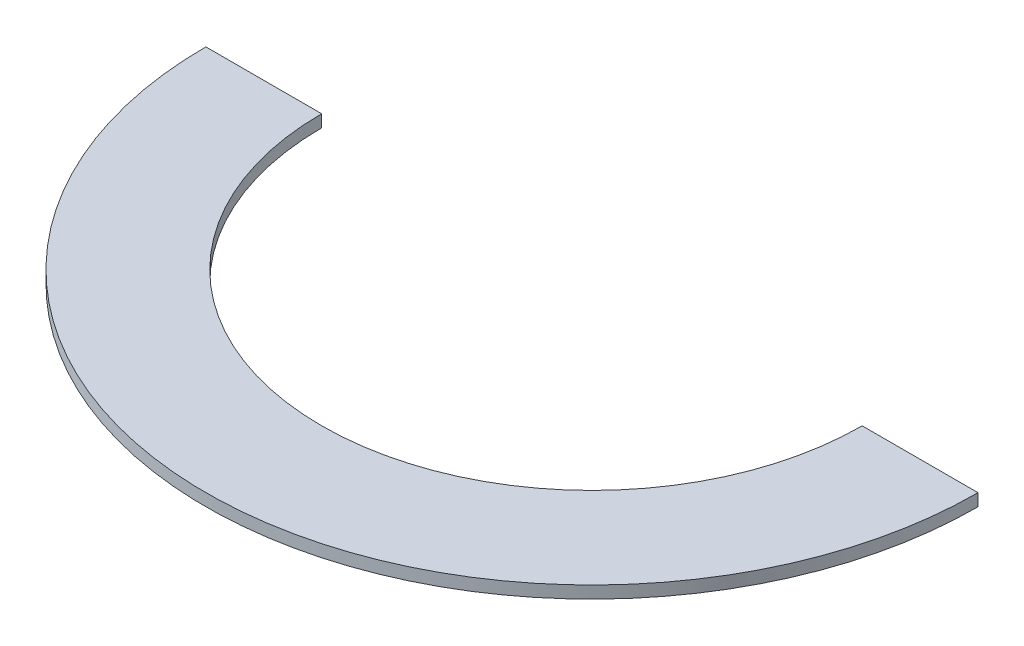
ISO-10303-21;
HEADER;
FILE_DESCRIPTION(('STEP AP214'),'2;1');
FILE_NAME('part.step','',(''),(''),'','','');
FILE_SCHEMA(('AUTOMOTIVE_DESIGN { 1 0 10303 214 1 1 1 1 }'));
ENDSEC;
DATA;
#1=APPLICATION_CONTEXT('core data for automotive mechanical design processes');
#2=APPLICATION_PROTOCOL_DEFINITION('international standard','automotive_design',2000,#1);
#3=PRODUCT_CONTEXT('',#1,'mechanical');
#4=PRODUCT('Part','Part','',(#3));
#5=PRODUCT_RELATED_PRODUCT_CATEGORY('part','',(#4));
#6=PRODUCT_DEFINITION_FORMATION('','',#4);
#7=PRODUCT_DEFINITION_CONTEXT('part definition',#1,'design');
#8=PRODUCT_DEFINITION('design','',#6,#7);
#9=PRODUCT_DEFINITION_SHAPE('','',#8);
#10=(LENGTH_UNIT() NAMED_UNIT(*) SI_UNIT(.MILLI.,.METRE.));
#11=(NAMED_UNIT(*) PLANE_ANGLE_UNIT() SI_UNIT($,.RADIAN.));
#12=(NAMED_UNIT(*) SI_UNIT($,.STERADIAN.) SOLID_ANGLE_UNIT());
#13=UNCERTAINTY_MEASURE_WITH_UNIT(LENGTH_MEASURE(1.E-05),#10,'distance_accuracy_value','');
#14=(GEOMETRIC_REPRESENTATION_CONTEXT(3) GLOBAL_UNCERTAINTY_ASSIGNED_CONTEXT((#13)) GLOBAL_UNIT_ASSIGNED_CONTEXT((#10,
#11,#12)) REPRESENTATION_CONTEXT('',''));
#15=CARTESIAN_POINT('',(0.,0.,0.));
#16=DIRECTION('',(0.,0.,1.));
#17=DIRECTION('',(1.,0.,0.));
#18=AXIS2_PLACEMENT_3D('',#15,#16,#17);
#19=CARTESIAN_POINT('',(0.,1.5875,0.));
#20=DIRECTION('',(0.,-1.,0.));
#21=DIRECTION('',(0.,0.,-1.));
#22=AXIS2_PLACEMENT_3D('',#19,#20,#21);
#23=CYLINDRICAL_SURFACE('',#22,50.);
#24=CARTESIAN_POINT('',(0.,0.,0.));
#25=DIRECTION('',(0.,1.,0.));
#26=DIRECTION('',(0.,0.,1.));
#27=AXIS2_PLACEMENT_3D('',#24,#25,#26);
#28=CIRCLE('',#27,50.);
#29=CARTESIAN_POINT('',(-50.,0.,0.));
#30=VERTEX_POINT('',#29);
#31=CARTESIAN_POINT('',(50.,0.,0.));
#32=VERTEX_POINT('',#31);
#33=EDGE_CURVE('E96',#30,#32,#28,.T.);
#34=ORIENTED_EDGE('',*,*,#33,.T.);
#35=DIRECTION('',(0.,-1.,0.));
#36=VECTOR('',#35,1.);
#37=CARTESIAN_POINT('',(50.,1.5875,0.));
#38=LINE('',#37,#36);
#39=CARTESIAN_POINT('',(50.,1.5875,0.));
#40=VERTEX_POINT('',#39);
#41=EDGE_CURVE('E11',#40,#32,#38,.T.);
#42=ORIENTED_EDGE('',*,*,#41,.F.);
#43=CARTESIAN_POINT('',(0.,1.5875,0.));
#44=DIRECTION('',(0.,1.,0.));
#45=DIRECTION('',(0.,0.,1.));
#46=AXIS2_PLACEMENT_3D('',#43,#44,#45);
#47=CIRCLE('',#46,50.);
#48=CARTESIAN_POINT('',(-50.,1.5875,0.));
#49=VERTEX_POINT('',#48);
#50=EDGE_CURVE('E84',#49,#40,#47,.T.);
#51=ORIENTED_EDGE('',*,*,#50,.F.);
#52=DIRECTION('',(0.,-1.,0.));
#53=VECTOR('',#52,1.);
#54=CARTESIAN_POINT('',(-50.,1.5875,0.));
#55=LINE('',#54,#53);
#56=EDGE_CURVE('E92',#49,#30,#55,.T.);
#57=ORIENTED_EDGE('',*,*,#56,.T.);
#58=EDGE_LOOP('',(#34,#42,#51,#57));
#59=FACE_BOUND('',#58,.T.);
#60=ADVANCED_FACE('F33',(#59),#23,.T.);
#61=CARTESIAN_POINT('',(35.,1.5875,0.));
#62=DIRECTION('',(0.,0.,1.));
#63=DIRECTION('',(1.,0.,0.));
#64=AXIS2_PLACEMENT_3D('',#61,#62,#63);
#65=PLANE('',#64);
#66=DIRECTION('',(-1.,0.,0.));
#67=VECTOR('',#66,1.);
#68=CARTESIAN_POINT('',(35.,0.,0.));
#69=LINE('',#68,#67);
#70=CARTESIAN_POINT('',(35.,0.,0.));
#71=VERTEX_POINT('',#70);
#72=EDGE_CURVE('E88',#32,#71,#69,.T.);
#73=ORIENTED_EDGE('',*,*,#72,.T.);
#74=DIRECTION('',(0.,-1.,0.));
#75=VECTOR('',#74,1.);
#76=CARTESIAN_POINT('',(35.,1.5875,0.));
#77=LINE('',#76,#75);
#78=CARTESIAN_POINT('',(35.,1.5875,0.));
#79=VERTEX_POINT('',#78);
#80=EDGE_CURVE('E41',#79,#71,#77,.T.);
#81=ORIENTED_EDGE('',*,*,#80,.F.);
#82=DIRECTION('',(-1.,0.,0.));
#83=VECTOR('',#82,1.);
#84=CARTESIAN_POINT('',(35.,1.5875,0.));
#85=LINE('',#84,#83);
#86=EDGE_CURVE('E79',#40,#79,#85,.T.);
#87=ORIENTED_EDGE('',*,*,#86,.F.);
#88=ORIENTED_EDGE('',*,*,#41,.T.);
#89=EDGE_LOOP('',(#73,#81,#87,#88));
#90=FACE_BOUND('',#89,.T.);
#91=ADVANCED_FACE('F87',(#90),#65,.F.);
#92=CARTESIAN_POINT('',(0.,1.5875,0.));
#93=DIRECTION('',(0.,-1.,0.));
#94=DIRECTION('',(0.,0.,-1.));
#95=AXIS2_PLACEMENT_3D('',#92,#93,#94);
#96=CYLINDRICAL_SURFACE('',#95,35.);
#97=CARTESIAN_POINT('',(0.,0.,0.));
#98=DIRECTION('',(0.,-1.,0.));
#99=DIRECTION('',(0.,0.,1.));
#100=AXIS2_PLACEMENT_3D('',#97,#98,#99);
#101=CIRCLE('',#100,35.);
#102=CARTESIAN_POINT('',(-35.,0.,0.));
#103=VERTEX_POINT('',#102);
#104=EDGE_CURVE('E66',#71,#103,#101,.T.);
#105=ORIENTED_EDGE('',*,*,#104,.T.);
#106=DIRECTION('',(0.,-1.,0.));
#107=VECTOR('',#106,1.);
#108=CARTESIAN_POINT('',(-35.,1.5875,0.));
#109=LINE('',#108,#107);
#110=CARTESIAN_POINT('',(-35.,1.5875,0.));
#111=VERTEX_POINT('',#110);
#112=EDGE_CURVE('E89',#111,#103,#109,.T.);
#113=ORIENTED_EDGE('',*,*,#112,.F.);
#114=CARTESIAN_POINT('',(0.,1.5875,0.));
#115=DIRECTION('',(0.,-1.,0.));
#116=DIRECTION('',(0.,0.,1.));
#117=AXIS2_PLACEMENT_3D('',#114,#115,#116);
#118=CIRCLE('',#117,35.);
#119=EDGE_CURVE('E82',#79,#111,#118,.T.);
#120=ORIENTED_EDGE('',*,*,#119,.F.);
#121=ORIENTED_EDGE('',*,*,#80,.T.);
#122=EDGE_LOOP('',(#105,#113,#120,#121));
#123=FACE_BOUND('',#122,.T.);
#124=ADVANCED_FACE('F90',(#123),#96,.F.);
#125=CARTESIAN_POINT('',(-50.,1.5875,0.));
#126=DIRECTION('',(0.,0.,1.));
#127=DIRECTION('',(1.,0.,0.));
#128=AXIS2_PLACEMENT_3D('',#125,#126,#127);
#129=PLANE('',#128);
#130=DIRECTION('',(-1.,0.,0.));
#131=VECTOR('',#130,1.);
#132=CARTESIAN_POINT('',(-50.,0.,0.));
#133=LINE('',#132,#131);
#134=EDGE_CURVE('E72',#103,#30,#133,.T.);
#135=ORIENTED_EDGE('',*,*,#134,.T.);
#136=ORIENTED_EDGE('',*,*,#56,.F.);
#137=DIRECTION('',(-1.,0.,0.));
#138=VECTOR('',#137,1.);
#139=CARTESIAN_POINT('',(-50.,1.5875,0.));
#140=LINE('',#139,#138);
#141=EDGE_CURVE('E49',#111,#49,#140,.T.);
#142=ORIENTED_EDGE('',*,*,#141,.F.);
#143=ORIENTED_EDGE('',*,*,#112,.T.);
#144=EDGE_LOOP('',(#135,#136,#142,#143));
#145=FACE_BOUND('',#144,.T.);
#146=ADVANCED_FACE('F103',(#145),#129,.F.);
#147=CARTESIAN_POINT('',(0.,1.5875,0.));
#148=DIRECTION('',(0.,1.,0.));
#149=DIRECTION('',(0.,0.,1.));
#150=AXIS2_PLACEMENT_3D('',#147,#148,#149);
#151=PLANE('',#150);
#152=ORIENTED_EDGE('',*,*,#50,.T.);
#153=ORIENTED_EDGE('',*,*,#86,.T.);
#154=ORIENTED_EDGE('',*,*,#119,.T.);
#155=ORIENTED_EDGE('',*,*,#141,.T.);
#156=EDGE_LOOP('',(#152,#153,#154,#155));
#157=FACE_BOUND('',#156,.T.);
#158=ADVANCED_FACE('F80',(#157),#151,.T.);
#159=CARTESIAN_POINT('',(0.,0.,0.));
#160=DIRECTION('',(0.,1.,0.));
#161=DIRECTION('',(0.,0.,1.));
#162=AXIS2_PLACEMENT_3D('',#159,#160,#161);
#163=PLANE('',#162);
#164=ORIENTED_EDGE('',*,*,#33,.F.);
#165=ORIENTED_EDGE('',*,*,#134,.F.);
#166=ORIENTED_EDGE('',*,*,#104,.F.);
#167=ORIENTED_EDGE('',*,*,#72,.F.);
#168=EDGE_LOOP('',(#164,#165,#166,#167));
#169=FACE_BOUND('',#168,.T.);
#170=ADVANCED_FACE('F106',(#169),#163,.F.);
#171=CLOSED_SHELL('',(#60,#91,#124,#146,#158,#170));
#172=MANIFOLD_SOLID_BREP('B2',#171);
#173=ADVANCED_BREP_SHAPE_REPRESENTATION('',(#18,#172),#14);
#174=SHAPE_DEFINITION_REPRESENTATION(#9,#173);
ENDSEC;
END-ISO-10303-21;
